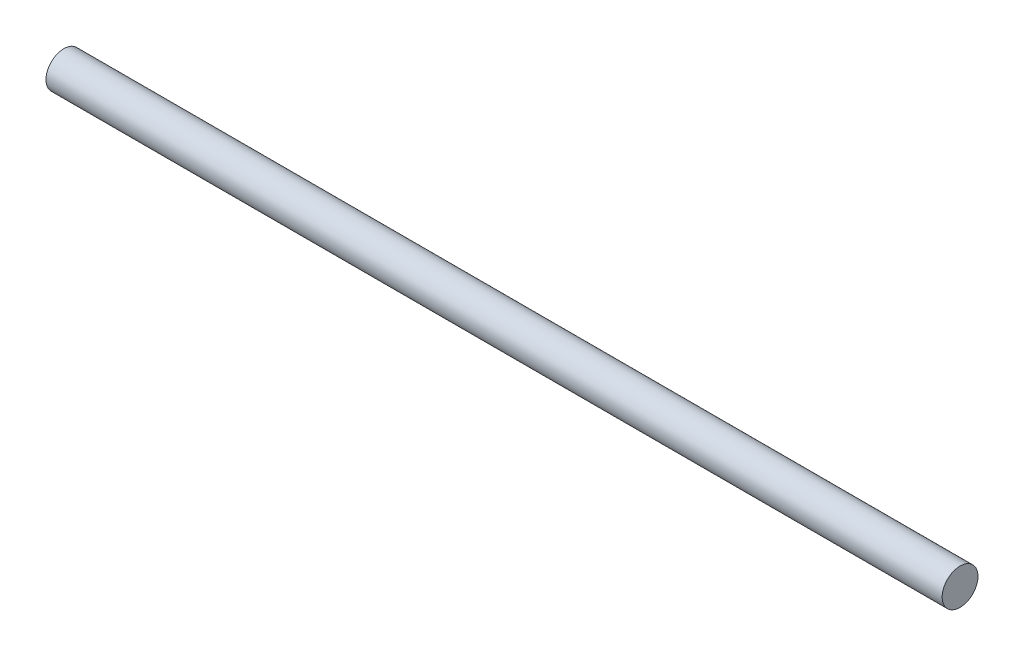
ISO-10303-21;
HEADER;
FILE_DESCRIPTION(('STEP AP214'),'2;1');
FILE_NAME('part.step','',(''),(''),'','','');
FILE_SCHEMA(('AUTOMOTIVE_DESIGN { 1 0 10303 214 1 1 1 1 }'));
ENDSEC;
DATA;
#1=APPLICATION_CONTEXT('core data for automotive mechanical design processes');
#2=APPLICATION_PROTOCOL_DEFINITION('international standard','automotive_design',2000,#1);
#3=PRODUCT_CONTEXT('',#1,'mechanical');
#4=PRODUCT('Part','Part','',(#3));
#5=PRODUCT_RELATED_PRODUCT_CATEGORY('part','',(#4));
#6=PRODUCT_DEFINITION_FORMATION('','',#4);
#7=PRODUCT_DEFINITION_CONTEXT('part definition',#1,'design');
#8=PRODUCT_DEFINITION('design','',#6,#7);
#9=PRODUCT_DEFINITION_SHAPE('','',#8);
#10=(LENGTH_UNIT() NAMED_UNIT(*) SI_UNIT(.MILLI.,.METRE.));
#11=(NAMED_UNIT(*) PLANE_ANGLE_UNIT() SI_UNIT($,.RADIAN.));
#12=(NAMED_UNIT(*) SI_UNIT($,.STERADIAN.) SOLID_ANGLE_UNIT());
#13=UNCERTAINTY_MEASURE_WITH_UNIT(LENGTH_MEASURE(1.E-05),#10,'distance_accuracy_value','');
#14=(GEOMETRIC_REPRESENTATION_CONTEXT(3) GLOBAL_UNCERTAINTY_ASSIGNED_CONTEXT((#13)) GLOBAL_UNIT_ASSIGNED_CONTEXT((#10,
#11,#12)) REPRESENTATION_CONTEXT('',''));
#15=CARTESIAN_POINT('',(0.,0.,0.));
#16=DIRECTION('',(0.,0.,1.));
#17=DIRECTION('',(1.,0.,0.));
#18=AXIS2_PLACEMENT_3D('',#15,#16,#17);
#19=CARTESIAN_POINT('',(100.,0.,0.));
#20=DIRECTION('',(-1.,0.,0.));
#21=DIRECTION('',(0.,0.,1.));
#22=AXIS2_PLACEMENT_3D('',#19,#20,#21);
#23=CYLINDRICAL_SURFACE('',#22,2.);
#24=CARTESIAN_POINT('',(100.,0.,0.));
#25=DIRECTION('',(1.,0.,0.));
#26=DIRECTION('',(0.,0.,-1.));
#27=AXIS2_PLACEMENT_3D('',#24,#25,#26);
#28=CIRCLE('',#27,2.);
#29=CARTESIAN_POINT('',(100.,0.,-2.));
#30=VERTEX_POINT('',#29);
#31=EDGE_CURVE('E10',#30,#30,#28,.T.);
#32=ORIENTED_EDGE('',*,*,#31,.F.);
#33=EDGE_LOOP('',(#32));
#34=FACE_BOUND('',#33,.T.);
#35=CARTESIAN_POINT('',(0.,0.,0.));
#36=DIRECTION('',(1.,0.,0.));
#37=DIRECTION('',(0.,0.,-1.));
#38=AXIS2_PLACEMENT_3D('',#35,#36,#37);
#39=CIRCLE('',#38,2.);
#40=CARTESIAN_POINT('',(0.,0.,-2.));
#41=VERTEX_POINT('',#40);
#42=EDGE_CURVE('E41',#41,#41,#39,.T.);
#43=ORIENTED_EDGE('',*,*,#42,.T.);
#44=EDGE_LOOP('',(#43));
#45=FACE_BOUND('',#44,.T.);
#46=ADVANCED_FACE('F38',(#34,#45),#23,.T.);
#47=CARTESIAN_POINT('',(100.,0.,0.));
#48=DIRECTION('',(1.,0.,0.));
#49=DIRECTION('',(0.,0.,-1.));
#50=AXIS2_PLACEMENT_3D('',#47,#48,#49);
#51=PLANE('',#50);
#52=ORIENTED_EDGE('',*,*,#31,.T.);
#53=EDGE_LOOP('',(#52));
#54=FACE_BOUND('',#53,.T.);
#55=ADVANCED_FACE('F53',(#54),#51,.T.);
#56=CARTESIAN_POINT('',(0.,0.,0.));
#57=DIRECTION('',(1.,0.,0.));
#58=DIRECTION('',(0.,0.,-1.));
#59=AXIS2_PLACEMENT_3D('',#56,#57,#58);
#60=PLANE('',#59);
#61=ORIENTED_EDGE('',*,*,#42,.F.);
#62=EDGE_LOOP('',(#61));
#63=FACE_BOUND('',#62,.T.);
#64=ADVANCED_FACE('F51',(#63),#60,.F.);
#65=CLOSED_SHELL('',(#46,#55,#64));
#66=MANIFOLD_SOLID_BREP('B2',#65);
#67=ADVANCED_BREP_SHAPE_REPRESENTATION('',(#18,#66),#14);
#68=SHAPE_DEFINITION_REPRESENTATION(#9,#67);
ENDSEC;
END-ISO-10303-21;
